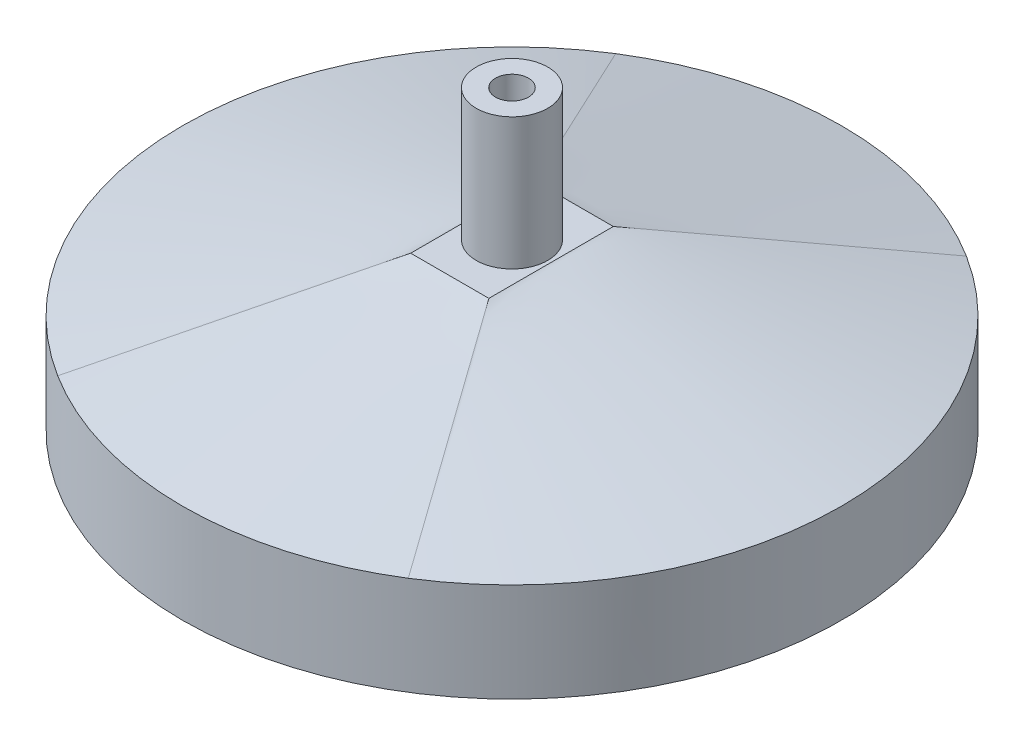
ISO-10303-21;
HEADER;
FILE_DESCRIPTION(('STEP AP214'),'2;1');
FILE_NAME('part.step','',(''),(''),'','','');
FILE_SCHEMA(('AUTOMOTIVE_DESIGN { 1 0 10303 214 1 1 1 1 }'));
ENDSEC;
DATA;
#1=APPLICATION_CONTEXT('core data for automotive mechanical design processes');
#2=APPLICATION_PROTOCOL_DEFINITION('international standard','automotive_design',2000,#1);
#3=PRODUCT_CONTEXT('',#1,'mechanical');
#4=PRODUCT('Part','Part','',(#3));
#5=PRODUCT_RELATED_PRODUCT_CATEGORY('part','',(#4));
#6=PRODUCT_DEFINITION_FORMATION('','',#4);
#7=PRODUCT_DEFINITION_CONTEXT('part definition',#1,'design');
#8=PRODUCT_DEFINITION('design','',#6,#7);
#9=PRODUCT_DEFINITION_SHAPE('','',#8);
#10=(LENGTH_UNIT() NAMED_UNIT(*) SI_UNIT(.MILLI.,.METRE.));
#11=(NAMED_UNIT(*) PLANE_ANGLE_UNIT() SI_UNIT($,.RADIAN.));
#12=(NAMED_UNIT(*) SI_UNIT($,.STERADIAN.) SOLID_ANGLE_UNIT());
#13=UNCERTAINTY_MEASURE_WITH_UNIT(LENGTH_MEASURE(1.E-05),#10,'distance_accuracy_value','');
#14=(GEOMETRIC_REPRESENTATION_CONTEXT(3) GLOBAL_UNCERTAINTY_ASSIGNED_CONTEXT((#13)) GLOBAL_UNIT_ASSIGNED_CONTEXT((#10,
#11,#12)) REPRESENTATION_CONTEXT('',''));
#15=CARTESIAN_POINT('',(0.,0.,0.));
#16=DIRECTION('',(0.,0.,1.));
#17=DIRECTION('',(1.,0.,0.));
#18=AXIS2_PLACEMENT_3D('',#15,#16,#17);
#19=CARTESIAN_POINT('',(0.,4.,0.));
#20=DIRECTION('',(0.,1.,0.));
#21=DIRECTION('',(0.,0.,1.));
#22=AXIS2_PLACEMENT_3D('',#19,#20,#21);
#23=PLANE('',#22);
#24=CARTESIAN_POINT('',(0.,4.,0.));
#25=DIRECTION('',(0.,1.,0.));
#26=DIRECTION('',(0.,0.,1.));
#27=AXIS2_PLACEMENT_3D('',#24,#25,#26);
#28=CIRCLE('',#27,1.085);
#29=CARTESIAN_POINT('',(0.,4.,1.085));
#30=VERTEX_POINT('',#29);
#31=EDGE_CURVE('E12',#30,#30,#28,.T.);
#32=ORIENTED_EDGE('',*,*,#31,.T.);
#33=EDGE_LOOP('',(#32));
#34=FACE_BOUND('',#33,.T.);
#35=CARTESIAN_POINT('',(0.,4.,0.));
#36=DIRECTION('',(0.,1.,0.));
#37=DIRECTION('',(0.,0.,1.));
#38=AXIS2_PLACEMENT_3D('',#35,#36,#37);
#39=CIRCLE('',#38,0.5);
#40=CARTESIAN_POINT('',(0.,4.,0.5));
#41=VERTEX_POINT('',#40);
#42=EDGE_CURVE('E80',#41,#41,#39,.T.);
#43=ORIENTED_EDGE('',*,*,#42,.F.);
#44=EDGE_LOOP('',(#43));
#45=FACE_BOUND('',#44,.T.);
#46=ADVANCED_FACE('F69',(#34,#45),#23,.T.);
#47=CARTESIAN_POINT('',(0.,4.,0.));
#48=DIRECTION('',(0.,-1.,0.));
#49=DIRECTION('',(0.,0.,-1.));
#50=AXIS2_PLACEMENT_3D('',#47,#48,#49);
#51=CYLINDRICAL_SURFACE('',#50,1.085);
#52=ORIENTED_EDGE('',*,*,#31,.F.);
#53=EDGE_LOOP('',(#52));
#54=FACE_BOUND('',#53,.T.);
#55=CARTESIAN_POINT('',(0.,0.,0.));
#56=DIRECTION('',(0.,1.,0.));
#57=DIRECTION('',(0.,0.,1.));
#58=AXIS2_PLACEMENT_3D('',#55,#56,#57);
#59=CIRCLE('',#58,1.085);
#60=CARTESIAN_POINT('',(0.,0.,1.085));
#61=VERTEX_POINT('',#60);
#62=EDGE_CURVE('E127',#61,#61,#59,.T.);
#63=ORIENTED_EDGE('',*,*,#62,.T.);
#64=EDGE_LOOP('',(#63));
#65=FACE_BOUND('',#64,.T.);
#66=ADVANCED_FACE('F71',(#54,#65),#51,.T.);
#67=CARTESIAN_POINT('',(0.,4.,0.));
#68=DIRECTION('',(0.,-1.,0.));
#69=DIRECTION('',(0.,0.,-1.));
#70=AXIS2_PLACEMENT_3D('',#67,#68,#69);
#71=CYLINDRICAL_SURFACE('',#70,0.5);
#72=ORIENTED_EDGE('',*,*,#42,.T.);
#73=EDGE_LOOP('',(#72));
#74=FACE_BOUND('',#73,.T.);
#75=CARTESIAN_POINT('',(0.,0.,0.));
#76=DIRECTION('',(0.,1.,0.));
#77=DIRECTION('',(0.,0.,1.));
#78=AXIS2_PLACEMENT_3D('',#75,#76,#77);
#79=CIRCLE('',#78,0.5);
#80=CARTESIAN_POINT('',(0.,0.,0.5));
#81=VERTEX_POINT('',#80);
#82=EDGE_CURVE('E206',#81,#81,#79,.T.);
#83=ORIENTED_EDGE('',*,*,#82,.F.);
#84=EDGE_LOOP('',(#83));
#85=FACE_BOUND('',#84,.T.);
#86=ADVANCED_FACE('F186',(#74,#85),#71,.F.);
#87=CARTESIAN_POINT('',(0.,0.,0.));
#88=DIRECTION('',(0.,-1.,0.));
#89=DIRECTION('',(0.,0.,-1.));
#90=AXIS2_PLACEMENT_3D('',#87,#88,#89);
#91=PLANE('',#90);
#92=ORIENTED_EDGE('',*,*,#82,.T.);
#93=EDGE_LOOP('',(#92));
#94=FACE_BOUND('',#93,.T.);
#95=ADVANCED_FACE('F193',(#94),#91,.F.);
#96=ORIENTED_EDGE('',*,*,#62,.F.);
#97=EDGE_LOOP('',(#96));
#98=FACE_BOUND('',#97,.T.);
#99=DIRECTION('',(0.,0.,-1.));
#100=VECTOR('',#99,1.);
#101=CARTESIAN_POINT('',(-1.18652788247661,0.,1.88841761577262));
#102=LINE('',#101,#100);
#103=CARTESIAN_POINT('',(-1.18652788247661,0.,1.88841761577262));
#104=VERTEX_POINT('',#103);
#105=CARTESIAN_POINT('',(-1.18652788247661,0.,-1.88841761577263));
#106=VERTEX_POINT('',#105);
#107=EDGE_CURVE('E216',#104,#106,#102,.T.);
#108=ORIENTED_EDGE('',*,*,#107,.F.);
#109=DIRECTION('',(-1.,0.,0.));
#110=VECTOR('',#109,1.);
#111=CARTESIAN_POINT('',(-1.18652788247661,0.,1.88841761577262));
#112=LINE('',#111,#110);
#113=CARTESIAN_POINT('',(1.18652788247661,0.,1.88841761577262));
#114=VERTEX_POINT('',#113);
#115=EDGE_CURVE('E156',#114,#104,#112,.T.);
#116=ORIENTED_EDGE('',*,*,#115,.F.);
#117=DIRECTION('',(0.,0.,1.));
#118=VECTOR('',#117,1.);
#119=CARTESIAN_POINT('',(1.18652788247661,0.,1.88841761577262));
#120=LINE('',#119,#118);
#121=CARTESIAN_POINT('',(1.18652788247661,0.,-1.88841761577262));
#122=VERTEX_POINT('',#121);
#123=EDGE_CURVE('E144',#122,#114,#120,.T.);
#124=ORIENTED_EDGE('',*,*,#123,.F.);
#125=DIRECTION('',(1.,0.,0.));
#126=VECTOR('',#125,1.);
#127=CARTESIAN_POINT('',(-1.18652788247661,0.,-1.88841761577263));
#128=LINE('',#127,#126);
#129=EDGE_CURVE('E96',#106,#122,#128,.T.);
#130=ORIENTED_EDGE('',*,*,#129,.F.);
#131=EDGE_LOOP('',(#108,#116,#124,#130));
#132=FACE_BOUND('',#131,.T.);
#133=ADVANCED_FACE('F257',(#98,#132),#91,.F.);
#134=CARTESIAN_POINT('',(-1.18652788247661,0.,1.88841761577262));
#135=CARTESIAN_POINT('',(-5.32018076890368,-2.,8.46732995614246));
#136=CARTESIAN_POINT('',(-1.18652788247661,0.,1.7310494811249));
#137=CARTESIAN_POINT('',(-5.91764474045524,-2.,8.09193223950387));
#138=CARTESIAN_POINT('',(-1.18652788247661,0.,1.57368134647719));
#139=CARTESIAN_POINT('',(-6.51125324100307,-2.,7.63030193760606));
#140=CARTESIAN_POINT('',(-1.18652788247661,0.,1.25894507718175));
#141=CARTESIAN_POINT('',(-7.62352081051684,-2.,6.51919142832333));
#142=CARTESIAN_POINT('',(-1.18652788247661,0.,1.10157694253403));
#143=CARTESIAN_POINT('',(-8.14159103092143,-2.,5.86914685662891));
#144=CARTESIAN_POINT('',(-1.18652788247661,0.,0.786840673238591));
#145=CARTESIAN_POINT('',(-9.02045823827011,-2.,4.40042299229086));
#146=CARTESIAN_POINT('',(-1.18652788247661,0.,0.629472538590873));
#147=CARTESIAN_POINT('',(-9.38021083451021,-2.,3.58171344280471));
#148=CARTESIAN_POINT('',(-1.18652788247661,0.,0.314736269295435));
#149=CARTESIAN_POINT('',(-9.87042672624858,-2.,1.84165760335309));
#150=CARTESIAN_POINT('',(-1.18652788247661,0.,0.157368134647716));
#151=CARTESIAN_POINT('',(-10.,-2.,0.921152093858784));
#152=CARTESIAN_POINT('',(-1.18652788247661,0.,-0.157368134647721));
#153=CARTESIAN_POINT('',(-10.,-2.,-0.921152093858793));
#154=CARTESIAN_POINT('',(-1.18652788247661,0.,-0.31473626929544));
#155=CARTESIAN_POINT('',(-9.87042672624859,-2.,-1.8416576033531));
#156=CARTESIAN_POINT('',(-1.18652788247661,0.,-0.629472538590877));
#157=CARTESIAN_POINT('',(-9.38021083451021,-2.,-3.58171344280472));
#158=CARTESIAN_POINT('',(-1.18652788247661,0.,-0.786840673238595));
#159=CARTESIAN_POINT('',(-9.02045823827011,-2.,-4.40042299229087));
#160=CARTESIAN_POINT('',(-1.18652788247661,0.,-1.10157694253403));
#161=CARTESIAN_POINT('',(-8.14159103092143,-2.,-5.86914685662891));
#162=CARTESIAN_POINT('',(-1.18652788247661,0.,-1.25894507718175));
#163=CARTESIAN_POINT('',(-7.62352081051684,-2.,-6.51919142832334));
#164=CARTESIAN_POINT('',(-1.18652788247661,0.,-1.57368134647719));
#165=CARTESIAN_POINT('',(-6.51125324100305,-2.,-7.63030193760607));
#166=CARTESIAN_POINT('',(-1.18652788247661,0.,-1.73104948112491));
#167=CARTESIAN_POINT('',(-5.91764474045524,-2.,-8.09193223950387));
#168=CARTESIAN_POINT('',(-1.18652788247661,0.,-1.88841761577262));
#169=CARTESIAN_POINT('',(-5.32018076890367,-2.,-8.46732995614247));
#170=B_SPLINE_SURFACE_WITH_KNOTS('',3,1,((#134,#135),(#136,#137),(#138,#139),(#140,#141),(#142,
#143),(#144,#145),(#146,#147),(#148,#149),(#150,#151),(#152,#153),(#154,#155),(#156,#157),(#158,
#159),(#160,#161),(#162,#163),(#164,#165),(#166,#167),(#168,#169)),.UNSPECIFIED.,.F.,.F.,.F.,(4,
2,2,2,2,2,2,2,4),(2,2),(0.,0.125,0.25,0.375,0.5,0.625,0.75,0.875,1.),(0.,1.),.UNSPECIFIED.);
#171=DIRECTION('',(-0.515222757517334,-0.249282061979165,-0.820002416893786));
#172=VECTOR('',#171,1.);
#173=CARTESIAN_POINT('',(-3.25335432569014,-1.,-5.17787378595755));
#174=LINE('',#173,#172);
#175=CARTESIAN_POINT('',(-5.32066260871662,-2.,-8.46809942401032));
#176=VERTEX_POINT('',#175);
#177=EDGE_CURVE('E149',#106,#176,#174,.T.);
#178=CARTESIAN_POINT('',(0.,-2.,0.));
#179=DIRECTION('',(0.,1.,0.));
#180=DIRECTION('',(0.,0.,1.));
#181=AXIS2_PLACEMENT_3D('',#178,#179,#180);
#182=CIRCLE('',#181,10.);
#183=CARTESIAN_POINT('',(-5.32065675739398,-2.,8.46809045039859));
#184=VERTEX_POINT('',#183);
#185=EDGE_CURVE('E73',#176,#184,#182,.T.);
#186=DIRECTION('',(0.515222757517335,0.249282061979166,-0.820002416893785));
#187=VECTOR('',#186,1.);
#188=CARTESIAN_POINT('',(-3.25335432569014,-1.,5.17787378595754));
#189=LINE('',#188,#187);
#190=EDGE_CURVE('E138',#184,#104,#189,.T.);
#191=ORIENTED_EDGE('',*,*,#107,.T.);
#192=ORIENTED_EDGE('',*,*,#177,.T.);
#193=ORIENTED_EDGE('',*,*,#185,.T.);
#194=ORIENTED_EDGE('',*,*,#190,.T.);
#195=EDGE_LOOP('',(#191,#192,#193,#194));
#196=FACE_BOUND('',#195,.T.);
#197=ADVANCED_FACE('F240',(#196),#170,.T.);
#198=CARTESIAN_POINT('',(-1.18652788247661,0.,-1.88841761577263));
#199=CARTESIAN_POINT('',(-5.32018076890367,-2.,-8.46732995614246));
#200=CARTESIAN_POINT('',(-0.988773235397171,0.,-1.88841761577263));
#201=CARTESIAN_POINT('',(-4.56938533562649,-2.,-8.93906867970601));
#202=CARTESIAN_POINT('',(-0.791018588317737,0.,-1.88841761577263));
#203=CARTESIAN_POINT('',(-3.72482480125539,-2.,-9.32795388823068));
#204=CARTESIAN_POINT('',(-0.395509294158868,0.,-1.88841761577263));
#205=CARTESIAN_POINT('',(-1.91978036440362,-2.,-9.85898001283375));
#206=CARTESIAN_POINT('',(-0.197754647079434,0.,-1.88841761577262));
#207=CARTESIAN_POINT('',(-0.960286946649101,-2.,-10.));
#208=CARTESIAN_POINT('',(0.197754647079435,0.,-1.88841761577262));
#209=CARTESIAN_POINT('',(0.960286946649108,-2.,-10.));
#210=CARTESIAN_POINT('',(0.395509294158869,0.,-1.88841761577262));
#211=CARTESIAN_POINT('',(1.91978036440362,-2.,-9.85898001283375));
#212=CARTESIAN_POINT('',(0.791018588317737,0.,-1.88841761577262));
#213=CARTESIAN_POINT('',(3.7248248012554,-2.,-9.32795388823068));
#214=CARTESIAN_POINT('',(0.988773235397172,0.,-1.88841761577262));
#215=CARTESIAN_POINT('',(4.56938533562649,-2.,-8.939068679706));
#216=CARTESIAN_POINT('',(1.18652788247661,0.,-1.88841761577262));
#217=CARTESIAN_POINT('',(5.32018076890368,-2.,-8.46732995614246));
#218=B_SPLINE_SURFACE_WITH_KNOTS('',3,1,((#198,#199),(#200,#201),(#202,#203),(#204,#205),(#206,
#207),(#208,#209),(#210,#211),(#212,#213),(#214,#215),(#216,#217)),.UNSPECIFIED.,.F.,.F.,.F.,(4,
2,2,2,4),(2,2),(0.,0.25,0.5,0.75,1.),(0.,1.),.UNSPECIFIED.);
#219=DIRECTION('',(0.515222757517335,-0.249282061979166,-0.820002416893785));
#220=VECTOR('',#219,1.);
#221=CARTESIAN_POINT('',(3.25335432569014,-1.,-5.17787378595754));
#222=LINE('',#221,#220);
#223=CARTESIAN_POINT('',(5.32065675739387,-2.,-8.4680904503984));
#224=VERTEX_POINT('',#223);
#225=EDGE_CURVE('E146',#122,#224,#222,.T.);
#226=EDGE_CURVE('E119',#224,#176,#182,.T.);
#227=ORIENTED_EDGE('',*,*,#129,.T.);
#228=ORIENTED_EDGE('',*,*,#225,.T.);
#229=ORIENTED_EDGE('',*,*,#226,.T.);
#230=ORIENTED_EDGE('',*,*,#177,.F.);
#231=EDGE_LOOP('',(#227,#228,#229,#230));
#232=FACE_BOUND('',#231,.T.);
#233=ADVANCED_FACE('F256',(#232),#218,.T.);
#234=CARTESIAN_POINT('',(1.18652788247661,0.,1.88841761577262));
#235=CARTESIAN_POINT('',(5.32018076890368,-2.,8.46732995614246));
#236=CARTESIAN_POINT('',(0.988773235397172,0.,1.88841761577262));
#237=CARTESIAN_POINT('',(4.56938533562649,-2.,8.939068679706));
#238=CARTESIAN_POINT('',(0.791018588317738,0.,1.88841761577262));
#239=CARTESIAN_POINT('',(3.72482480125539,-2.,9.32795388823068));
#240=CARTESIAN_POINT('',(0.395509294158869,0.,1.88841761577262));
#241=CARTESIAN_POINT('',(1.91978036440362,-2.,9.85898001283376));
#242=CARTESIAN_POINT('',(0.197754647079435,0.,1.88841761577262));
#243=CARTESIAN_POINT('',(0.960286946649104,-2.,10.));
#244=CARTESIAN_POINT('',(-0.197754647079434,0.,1.88841761577262));
#245=CARTESIAN_POINT('',(-0.960286946649105,-2.,10.));
#246=CARTESIAN_POINT('',(-0.395509294158868,0.,1.88841761577262));
#247=CARTESIAN_POINT('',(-1.91978036440362,-2.,9.85898001283375));
#248=CARTESIAN_POINT('',(-0.791018588317737,0.,1.88841761577262));
#249=CARTESIAN_POINT('',(-3.7248248012554,-2.,9.32795388823068));
#250=CARTESIAN_POINT('',(-0.988773235397171,0.,1.88841761577262));
#251=CARTESIAN_POINT('',(-4.56938533562649,-2.,8.939068679706));
#252=CARTESIAN_POINT('',(-1.18652788247661,0.,1.88841761577262));
#253=CARTESIAN_POINT('',(-5.32018076890368,-2.,8.46732995614246));
#254=B_SPLINE_SURFACE_WITH_KNOTS('',3,1,((#234,#235),(#236,#237),(#238,#239),(#240,#241),(#242,
#243),(#244,#245),(#246,#247),(#248,#249),(#250,#251),(#252,#253)),.UNSPECIFIED.,.F.,.F.,.F.,(4,
2,2,2,4),(2,2),(0.,0.25,0.5,0.75,1.),(0.,1.),.UNSPECIFIED.);
#255=CARTESIAN_POINT('',(5.32066260871678,-2.,8.46809942401058));
#256=VERTEX_POINT('',#255);
#257=EDGE_CURVE('E117',#184,#256,#182,.T.);
#258=DIRECTION('',(0.515222757517334,-0.249282061979165,0.820002416893786));
#259=VECTOR('',#258,1.);
#260=CARTESIAN_POINT('',(3.25335432569014,-1.,5.17787378595754));
#261=LINE('',#260,#259);
#262=EDGE_CURVE('E137',#114,#256,#261,.T.);
#263=ORIENTED_EDGE('',*,*,#115,.T.);
#264=ORIENTED_EDGE('',*,*,#190,.F.);
#265=ORIENTED_EDGE('',*,*,#257,.T.);
#266=ORIENTED_EDGE('',*,*,#262,.F.);
#267=EDGE_LOOP('',(#263,#264,#265,#266));
#268=FACE_BOUND('',#267,.T.);
#269=ADVANCED_FACE('F136',(#268),#254,.T.);
#270=CARTESIAN_POINT('',(1.18652788247661,0.,-1.88841761577262));
#271=CARTESIAN_POINT('',(5.32018076890368,-2.,-8.46732995614246));
#272=CARTESIAN_POINT('',(1.18652788247661,0.,-1.73104948112491));
#273=CARTESIAN_POINT('',(5.91764474045524,-2.,-8.09193223950387));
#274=CARTESIAN_POINT('',(1.18652788247661,0.,-1.57368134647719));
#275=CARTESIAN_POINT('',(6.51125324100306,-2.,-7.63030193760606));
#276=CARTESIAN_POINT('',(1.18652788247661,0.,-1.25894507718176));
#277=CARTESIAN_POINT('',(7.62352081051684,-2.,-6.51919142832333));
#278=CARTESIAN_POINT('',(1.18652788247661,0.,-1.10157694253404));
#279=CARTESIAN_POINT('',(8.14159103092143,-2.,-5.86914685662891));
#280=CARTESIAN_POINT('',(1.18652788247661,0.,-0.786840673238608));
#281=CARTESIAN_POINT('',(9.02045823827011,-2.,-4.40042299229087));
#282=CARTESIAN_POINT('',(1.18652788247661,0.,-0.62947253859089));
#283=CARTESIAN_POINT('',(9.3802108345102,-2.,-3.58171344280471));
#284=CARTESIAN_POINT('',(1.18652788247661,0.,-0.314736269295455));
#285=CARTESIAN_POINT('',(9.87042672624859,-2.,-1.84165760335309));
#286=CARTESIAN_POINT('',(1.18652788247661,0.,-0.157368134647737));
#287=CARTESIAN_POINT('',(10.,-2.,-0.921152093858787));
#288=CARTESIAN_POINT('',(1.18652788247661,0.,0.1573681346477));
#289=CARTESIAN_POINT('',(10.,-2.,0.921152093858791));
#290=CARTESIAN_POINT('',(1.18652788247661,0.,0.314736269295419));
#291=CARTESIAN_POINT('',(9.87042672624859,-2.,1.8416576033531));
#292=CARTESIAN_POINT('',(1.18652788247661,0.,0.629472538590858));
#293=CARTESIAN_POINT('',(9.38021083451021,-2.,3.58171344280472));
#294=CARTESIAN_POINT('',(1.18652788247661,0.,0.786840673238578));
#295=CARTESIAN_POINT('',(9.02045823827011,-2.,4.40042299229087));
#296=CARTESIAN_POINT('',(1.18652788247661,0.,1.10157694253402));
#297=CARTESIAN_POINT('',(8.14159103092143,-2.,5.86914685662892));
#298=CARTESIAN_POINT('',(1.18652788247661,0.,1.25894507718174));
#299=CARTESIAN_POINT('',(7.62352081051684,-2.,6.51919142832333));
#300=CARTESIAN_POINT('',(1.18652788247661,0.,1.57368134647718));
#301=CARTESIAN_POINT('',(6.51125324100306,-2.,7.63030193760606));
#302=CARTESIAN_POINT('',(1.18652788247661,0.,1.7310494811249));
#303=CARTESIAN_POINT('',(5.91764474045524,-2.,8.09193223950387));
#304=CARTESIAN_POINT('',(1.18652788247661,0.,1.88841761577262));
#305=CARTESIAN_POINT('',(5.32018076890367,-2.,8.46732995614246));
#306=B_SPLINE_SURFACE_WITH_KNOTS('',3,1,((#270,#271),(#272,#273),(#274,#275),(#276,#277),(#278,
#279),(#280,#281),(#282,#283),(#284,#285),(#286,#287),(#288,#289),(#290,#291),(#292,#293),(#294,
#295),(#296,#297),(#298,#299),(#300,#301),(#302,#303),(#304,#305)),.UNSPECIFIED.,.F.,.F.,.F.,(4,
2,2,2,2,2,2,2,4),(2,2),(0.,0.125,0.25,0.375,0.5,0.625,0.75,0.875,1.),(0.,1.),.UNSPECIFIED.);
#307=EDGE_CURVE('E113',#256,#224,#182,.T.);
#308=ORIENTED_EDGE('',*,*,#123,.T.);
#309=ORIENTED_EDGE('',*,*,#262,.T.);
#310=ORIENTED_EDGE('',*,*,#307,.T.);
#311=ORIENTED_EDGE('',*,*,#225,.F.);
#312=EDGE_LOOP('',(#308,#309,#310,#311));
#313=FACE_BOUND('',#312,.T.);
#314=ADVANCED_FACE('F143',(#313),#306,.T.);
#315=CARTESIAN_POINT('',(0.,-5.,0.));
#316=DIRECTION('',(0.,1.,0.));
#317=DIRECTION('',(0.,0.,1.));
#318=AXIS2_PLACEMENT_3D('',#315,#316,#317);
#319=CYLINDRICAL_SURFACE('',#318,10.);
#320=CARTESIAN_POINT('',(0.,-5.,0.));
#321=DIRECTION('',(0.,1.,0.));
#322=DIRECTION('',(0.,0.,1.));
#323=AXIS2_PLACEMENT_3D('',#320,#321,#322);
#324=CIRCLE('',#323,10.);
#325=CARTESIAN_POINT('',(0.,-5.,10.));
#326=VERTEX_POINT('',#325);
#327=EDGE_CURVE('E390',#326,#326,#324,.T.);
#328=ORIENTED_EDGE('',*,*,#327,.T.);
#329=EDGE_LOOP('',(#328));
#330=FACE_BOUND('',#329,.T.);
#331=ORIENTED_EDGE('',*,*,#307,.F.);
#332=ORIENTED_EDGE('',*,*,#257,.F.);
#333=ORIENTED_EDGE('',*,*,#185,.F.);
#334=ORIENTED_EDGE('',*,*,#226,.F.);
#335=EDGE_LOOP('',(#331,#332,#333,#334));
#336=FACE_BOUND('',#335,.T.);
#337=ADVANCED_FACE('F116',(#330,#336),#319,.T.);
#338=CARTESIAN_POINT('',(0.,-5.,0.));
#339=DIRECTION('',(0.,1.,0.));
#340=DIRECTION('',(0.,0.,1.));
#341=AXIS2_PLACEMENT_3D('',#338,#339,#340);
#342=PLANE('',#341);
#343=CARTESIAN_POINT('',(0.,-5.,0.));
#344=DIRECTION('',(0.,1.,0.));
#345=DIRECTION('',(0.,0.,1.));
#346=AXIS2_PLACEMENT_3D('',#343,#344,#345);
#347=CIRCLE('',#346,9.23205080756888);
#348=CARTESIAN_POINT('',(0.,-5.,9.23205080756888));
#349=VERTEX_POINT('',#348);
#350=EDGE_CURVE('E219',#349,#349,#347,.T.);
#351=ORIENTED_EDGE('',*,*,#350,.T.);
#352=EDGE_LOOP('',(#351));
#353=FACE_BOUND('',#352,.T.);
#354=ORIENTED_EDGE('',*,*,#327,.F.);
#355=EDGE_LOOP('',(#354));
#356=FACE_BOUND('',#355,.T.);
#357=ADVANCED_FACE('F288',(#353,#356),#342,.F.);
#358=CARTESIAN_POINT('',(0.,-4.,0.));
#359=DIRECTION('',(0.,-1.,0.));
#360=DIRECTION('',(0.,0.,-1.));
#361=AXIS2_PLACEMENT_3D('',#358,#359,#360);
#362=PLANE('',#361);
#363=CARTESIAN_POINT('',(0.,-4.,0.));
#364=DIRECTION('',(0.,-1.,0.));
#365=DIRECTION('',(0.,0.,-1.));
#366=AXIS2_PLACEMENT_3D('',#363,#364,#365);
#367=CIRCLE('',#366,7.5);
#368=CARTESIAN_POINT('',(0.,-4.,-7.5));
#369=VERTEX_POINT('',#368);
#370=EDGE_CURVE('E388',#369,#369,#367,.T.);
#371=ORIENTED_EDGE('',*,*,#370,.T.);
#372=EDGE_LOOP('',(#371));
#373=FACE_BOUND('',#372,.T.);
#374=ADVANCED_FACE('F296',(#373),#362,.T.);
#375=CARTESIAN_POINT('',(0.,-3.,0.));
#376=DIRECTION('',(0.,1.,0.));
#377=DIRECTION('',(0.,0.,1.));
#378=AXIS2_PLACEMENT_3D('',#375,#376,#377);
#379=TOROIDAL_SURFACE('',#378,9.23205080756888,2.);
#380=ORIENTED_EDGE('',*,*,#350,.F.);
#381=EDGE_LOOP('',(#380));
#382=FACE_BOUND('',#381,.T.);
#383=ORIENTED_EDGE('',*,*,#370,.F.);
#384=EDGE_LOOP('',(#383));
#385=FACE_BOUND('',#384,.T.);
#386=ADVANCED_FACE('F304',(#382,#385),#379,.T.);
#387=CLOSED_SHELL('',(#46,#66,#86,#95,#133,#197,#233,#269,#314,#337,#357,#374,#386));
#388=MANIFOLD_SOLID_BREP('B2',#387);
#389=ADVANCED_BREP_SHAPE_REPRESENTATION('',(#18,#388),#14);
#390=SHAPE_DEFINITION_REPRESENTATION(#9,#389);
ENDSEC;
END-ISO-10303-21;
